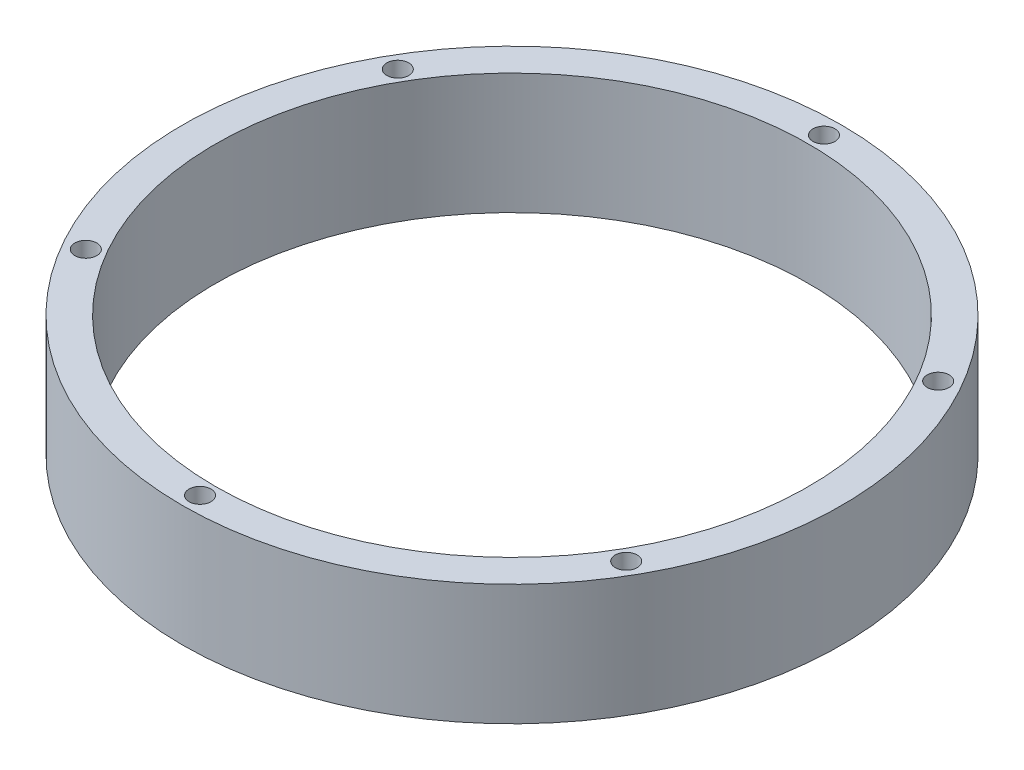
ISO-10303-21;
HEADER;
FILE_DESCRIPTION(('STEP AP214'),'2;1');
FILE_NAME('part.step','',(''),(''),'','','');
FILE_SCHEMA(('AUTOMOTIVE_DESIGN { 1 0 10303 214 1 1 1 1 }'));
ENDSEC;
DATA;
#1=APPLICATION_CONTEXT('core data for automotive mechanical design processes');
#2=APPLICATION_PROTOCOL_DEFINITION('international standard','automotive_design',2000,#1);
#3=PRODUCT_CONTEXT('',#1,'mechanical');
#4=PRODUCT('Part','Part','',(#3));
#5=PRODUCT_RELATED_PRODUCT_CATEGORY('part','',(#4));
#6=PRODUCT_DEFINITION_FORMATION('','',#4);
#7=PRODUCT_DEFINITION_CONTEXT('part definition',#1,'design');
#8=PRODUCT_DEFINITION('design','',#6,#7);
#9=PRODUCT_DEFINITION_SHAPE('','',#8);
#10=(LENGTH_UNIT() NAMED_UNIT(*) SI_UNIT(.MILLI.,.METRE.));
#11=(NAMED_UNIT(*) PLANE_ANGLE_UNIT() SI_UNIT($,.RADIAN.));
#12=(NAMED_UNIT(*) SI_UNIT($,.STERADIAN.) SOLID_ANGLE_UNIT());
#13=UNCERTAINTY_MEASURE_WITH_UNIT(LENGTH_MEASURE(1.E-05),#10,'distance_accuracy_value','');
#14=(GEOMETRIC_REPRESENTATION_CONTEXT(3) GLOBAL_UNCERTAINTY_ASSIGNED_CONTEXT((#13)) GLOBAL_UNIT_ASSIGNED_CONTEXT((#10,
#11,#12)) REPRESENTATION_CONTEXT('',''));
#15=CARTESIAN_POINT('',(0.,0.,0.));
#16=DIRECTION('',(0.,0.,1.));
#17=DIRECTION('',(1.,0.,0.));
#18=AXIS2_PLACEMENT_3D('',#15,#16,#17);
#19=CARTESIAN_POINT('',(0.,16.5,0.));
#20=DIRECTION('',(0.,1.,0.));
#21=DIRECTION('',(0.,0.,1.));
#22=AXIS2_PLACEMENT_3D('',#19,#20,#21);
#23=PLANE('',#22);
#24=CARTESIAN_POINT('',(-61.4878036686947,16.5,-35.5000000000007));
#25=DIRECTION('',(0.,1.,0.));
#26=DIRECTION('',(0.866025403784433,0.,0.50000000000001));
#27=AXIS2_PLACEMENT_3D('',#24,#25,#26);
#28=CIRCLE('',#27,2.5);
#29=CARTESIAN_POINT('',(-59.3227401592336,16.5,-34.2500000000007));
#30=VERTEX_POINT('',#29);
#31=EDGE_CURVE('E75',#30,#30,#28,.T.);
#32=ORIENTED_EDGE('',*,*,#31,.F.);
#33=EDGE_LOOP('',(#32));
#34=FACE_BOUND('',#33,.T.);
#35=CARTESIAN_POINT('',(-61.4878036686955,16.5,35.4999999999994));
#36=DIRECTION('',(0.,1.,0.));
#37=DIRECTION('',(0.866025403784443,0.,-0.499999999999992));
#38=AXIS2_PLACEMENT_3D('',#35,#36,#37);
#39=CIRCLE('',#38,2.5);
#40=CARTESIAN_POINT('',(-59.3227401592344,16.5,34.2499999999994));
#41=VERTEX_POINT('',#40);
#42=EDGE_CURVE('E83',#41,#41,#39,.T.);
#43=ORIENTED_EDGE('',*,*,#42,.F.);
#44=EDGE_LOOP('',(#43));
#45=FACE_BOUND('',#44,.T.);
#46=CARTESIAN_POINT('',(0.,16.5,71.));
#47=DIRECTION('',(0.,1.,0.));
#48=DIRECTION('',(0.,0.,-1.));
#49=AXIS2_PLACEMENT_3D('',#46,#47,#48);
#50=CIRCLE('',#49,2.5);
#51=CARTESIAN_POINT('',(0.,16.5,68.5));
#52=VERTEX_POINT('',#51);
#53=EDGE_CURVE('E91',#52,#52,#50,.T.);
#54=ORIENTED_EDGE('',*,*,#53,.F.);
#55=EDGE_LOOP('',(#54));
#56=FACE_BOUND('',#55,.T.);
#57=CARTESIAN_POINT('',(61.487803668695,16.5,35.5000000000003));
#58=DIRECTION('',(0.,1.,0.));
#59=DIRECTION('',(-0.866025403784436,0.,-0.500000000000004));
#60=AXIS2_PLACEMENT_3D('',#57,#58,#59);
#61=CIRCLE('',#60,2.5);
#62=CARTESIAN_POINT('',(59.3227401592339,16.5,34.2500000000003));
#63=VERTEX_POINT('',#62);
#64=EDGE_CURVE('E99',#63,#63,#61,.T.);
#65=ORIENTED_EDGE('',*,*,#64,.F.);
#66=EDGE_LOOP('',(#65));
#67=FACE_BOUND('',#66,.T.);
#68=CARTESIAN_POINT('',(61.4878036686952,16.5,-35.4999999999999));
#69=DIRECTION('',(0.,1.,0.));
#70=DIRECTION('',(-0.86602540378444,0.,0.499999999999998));
#71=AXIS2_PLACEMENT_3D('',#68,#69,#70);
#72=CIRCLE('',#71,2.5);
#73=CARTESIAN_POINT('',(59.3227401592341,16.5,-34.2499999999999));
#74=VERTEX_POINT('',#73);
#75=EDGE_CURVE('E67',#74,#74,#72,.T.);
#76=ORIENTED_EDGE('',*,*,#75,.F.);
#77=EDGE_LOOP('',(#76));
#78=FACE_BOUND('',#77,.T.);
#79=CARTESIAN_POINT('',(0.,16.5,-71.));
#80=DIRECTION('',(0.,1.,0.));
#81=DIRECTION('',(0.,0.,1.));
#82=AXIS2_PLACEMENT_3D('',#79,#80,#81);
#83=CIRCLE('',#82,2.5);
#84=CARTESIAN_POINT('',(0.,16.5,-68.5));
#85=VERTEX_POINT('',#84);
#86=EDGE_CURVE('E59',#85,#85,#83,.T.);
#87=ORIENTED_EDGE('',*,*,#86,.F.);
#88=EDGE_LOOP('',(#87));
#89=FACE_BOUND('',#88,.T.);
#90=CARTESIAN_POINT('',(0.,16.5,0.));
#91=DIRECTION('',(0.,1.,0.));
#92=DIRECTION('',(0.,0.,1.));
#93=AXIS2_PLACEMENT_3D('',#90,#91,#92);
#94=CIRCLE('',#93,75.);
#95=CARTESIAN_POINT('',(0.,16.5,75.));
#96=VERTEX_POINT('',#95);
#97=EDGE_CURVE('E10',#96,#96,#94,.T.);
#98=ORIENTED_EDGE('',*,*,#97,.T.);
#99=EDGE_LOOP('',(#98));
#100=FACE_BOUND('',#99,.T.);
#101=CARTESIAN_POINT('',(0.,16.5,0.));
#102=DIRECTION('',(0.,1.,0.));
#103=DIRECTION('',(0.,0.,1.));
#104=AXIS2_PLACEMENT_3D('',#101,#102,#103);
#105=CIRCLE('',#104,67.5);
#106=CARTESIAN_POINT('',(0.,16.5,67.5));
#107=VERTEX_POINT('',#106);
#108=EDGE_CURVE('E49',#107,#107,#105,.T.);
#109=ORIENTED_EDGE('',*,*,#108,.F.);
#110=EDGE_LOOP('',(#109));
#111=FACE_BOUND('',#110,.T.);
#112=ADVANCED_FACE('F36',(#34,#45,#56,#67,#78,#89,#100,#111),#23,.T.);
#113=CARTESIAN_POINT('',(0.,-11.,0.));
#114=DIRECTION('',(0.,1.,0.));
#115=DIRECTION('',(0.,0.,1.));
#116=AXIS2_PLACEMENT_3D('',#113,#114,#115);
#117=PLANE('',#116);
#118=CARTESIAN_POINT('',(-61.4878036686947,-11.,-35.5000000000007));
#119=DIRECTION('',(0.,1.,0.));
#120=DIRECTION('',(0.866025403784433,0.,0.50000000000001));
#121=AXIS2_PLACEMENT_3D('',#118,#119,#120);
#122=CIRCLE('',#121,2.5);
#123=CARTESIAN_POINT('',(-59.3227401592336,-11.,-34.2500000000007));
#124=VERTEX_POINT('',#123);
#125=EDGE_CURVE('E79',#124,#124,#122,.T.);
#126=ORIENTED_EDGE('',*,*,#125,.T.);
#127=EDGE_LOOP('',(#126));
#128=FACE_BOUND('',#127,.T.);
#129=CARTESIAN_POINT('',(-61.4878036686955,-11.,35.4999999999994));
#130=DIRECTION('',(0.,1.,0.));
#131=DIRECTION('',(0.866025403784443,0.,-0.499999999999992));
#132=AXIS2_PLACEMENT_3D('',#129,#130,#131);
#133=CIRCLE('',#132,2.5);
#134=CARTESIAN_POINT('',(-59.3227401592344,-11.,34.2499999999994));
#135=VERTEX_POINT('',#134);
#136=EDGE_CURVE('E87',#135,#135,#133,.T.);
#137=ORIENTED_EDGE('',*,*,#136,.T.);
#138=EDGE_LOOP('',(#137));
#139=FACE_BOUND('',#138,.T.);
#140=CARTESIAN_POINT('',(0.,-11.,71.));
#141=DIRECTION('',(0.,1.,0.));
#142=DIRECTION('',(0.,0.,-1.));
#143=AXIS2_PLACEMENT_3D('',#140,#141,#142);
#144=CIRCLE('',#143,2.5);
#145=CARTESIAN_POINT('',(0.,-11.,68.5));
#146=VERTEX_POINT('',#145);
#147=EDGE_CURVE('E95',#146,#146,#144,.T.);
#148=ORIENTED_EDGE('',*,*,#147,.T.);
#149=EDGE_LOOP('',(#148));
#150=FACE_BOUND('',#149,.T.);
#151=CARTESIAN_POINT('',(61.487803668695,-11.,35.5000000000003));
#152=DIRECTION('',(0.,1.,0.));
#153=DIRECTION('',(-0.866025403784436,0.,-0.500000000000004));
#154=AXIS2_PLACEMENT_3D('',#151,#152,#153);
#155=CIRCLE('',#154,2.5);
#156=CARTESIAN_POINT('',(59.3227401592339,-11.,34.2500000000003));
#157=VERTEX_POINT('',#156);
#158=EDGE_CURVE('E71',#157,#157,#155,.T.);
#159=ORIENTED_EDGE('',*,*,#158,.T.);
#160=EDGE_LOOP('',(#159));
#161=FACE_BOUND('',#160,.T.);
#162=CARTESIAN_POINT('',(61.4878036686952,-11.,-35.4999999999999));
#163=DIRECTION('',(0.,1.,0.));
#164=DIRECTION('',(-0.86602540378444,0.,0.499999999999998));
#165=AXIS2_PLACEMENT_3D('',#162,#163,#164);
#166=CIRCLE('',#165,2.5);
#167=CARTESIAN_POINT('',(59.3227401592341,-11.,-34.2499999999999));
#168=VERTEX_POINT('',#167);
#169=EDGE_CURVE('E63',#168,#168,#166,.T.);
#170=ORIENTED_EDGE('',*,*,#169,.T.);
#171=EDGE_LOOP('',(#170));
#172=FACE_BOUND('',#171,.T.);
#173=CARTESIAN_POINT('',(0.,-11.,-71.));
#174=DIRECTION('',(0.,1.,0.));
#175=DIRECTION('',(0.,0.,1.));
#176=AXIS2_PLACEMENT_3D('',#173,#174,#175);
#177=CIRCLE('',#176,2.5);
#178=CARTESIAN_POINT('',(0.,-11.,-68.5));
#179=VERTEX_POINT('',#178);
#180=EDGE_CURVE('E55',#179,#179,#177,.T.);
#181=ORIENTED_EDGE('',*,*,#180,.T.);
#182=EDGE_LOOP('',(#181));
#183=FACE_BOUND('',#182,.T.);
#184=CARTESIAN_POINT('',(0.,-11.,0.));
#185=DIRECTION('',(0.,1.,0.));
#186=DIRECTION('',(0.,0.,1.));
#187=AXIS2_PLACEMENT_3D('',#184,#185,#186);
#188=CIRCLE('',#187,75.);
#189=CARTESIAN_POINT('',(0.,-11.,75.));
#190=VERTEX_POINT('',#189);
#191=EDGE_CURVE('E40',#190,#190,#188,.T.);
#192=ORIENTED_EDGE('',*,*,#191,.F.);
#193=EDGE_LOOP('',(#192));
#194=FACE_BOUND('',#193,.T.);
#195=CARTESIAN_POINT('',(0.,-11.,0.));
#196=DIRECTION('',(0.,1.,0.));
#197=DIRECTION('',(0.,0.,1.));
#198=AXIS2_PLACEMENT_3D('',#195,#196,#197);
#199=CIRCLE('',#198,67.5);
#200=CARTESIAN_POINT('',(0.,-11.,67.5));
#201=VERTEX_POINT('',#200);
#202=EDGE_CURVE('E51',#201,#201,#199,.T.);
#203=ORIENTED_EDGE('',*,*,#202,.T.);
#204=EDGE_LOOP('',(#203));
#205=FACE_BOUND('',#204,.T.);
#206=ADVANCED_FACE('F107',(#128,#139,#150,#161,#172,#183,#194,#205),#117,.F.);
#207=CARTESIAN_POINT('',(0.,16.5,0.));
#208=DIRECTION('',(0.,-1.,0.));
#209=DIRECTION('',(0.,0.,-1.));
#210=AXIS2_PLACEMENT_3D('',#207,#208,#209);
#211=CYLINDRICAL_SURFACE('',#210,75.);
#212=ORIENTED_EDGE('',*,*,#97,.F.);
#213=EDGE_LOOP('',(#212));
#214=FACE_BOUND('',#213,.T.);
#215=ORIENTED_EDGE('',*,*,#191,.T.);
#216=EDGE_LOOP('',(#215));
#217=FACE_BOUND('',#216,.T.);
#218=ADVANCED_FACE('F38',(#214,#217),#211,.T.);
#219=CARTESIAN_POINT('',(0.,16.5,0.));
#220=DIRECTION('',(0.,-1.,0.));
#221=DIRECTION('',(0.,0.,-1.));
#222=AXIS2_PLACEMENT_3D('',#219,#220,#221);
#223=CYLINDRICAL_SURFACE('',#222,67.5);
#224=ORIENTED_EDGE('',*,*,#108,.T.);
#225=EDGE_LOOP('',(#224));
#226=FACE_BOUND('',#225,.T.);
#227=ORIENTED_EDGE('',*,*,#202,.F.);
#228=EDGE_LOOP('',(#227));
#229=FACE_BOUND('',#228,.T.);
#230=ADVANCED_FACE('F128',(#226,#229),#223,.F.);
#231=CARTESIAN_POINT('',(0.,-11.,-71.));
#232=DIRECTION('',(0.,1.,0.));
#233=DIRECTION('',(0.,0.,1.));
#234=AXIS2_PLACEMENT_3D('',#231,#232,#233);
#235=CYLINDRICAL_SURFACE('',#234,2.5);
#236=ORIENTED_EDGE('',*,*,#180,.F.);
#237=EDGE_LOOP('',(#236));
#238=FACE_BOUND('',#237,.T.);
#239=ORIENTED_EDGE('',*,*,#86,.T.);
#240=EDGE_LOOP('',(#239));
#241=FACE_BOUND('',#240,.T.);
#242=ADVANCED_FACE('F131',(#238,#241),#235,.F.);
#243=CARTESIAN_POINT('',(61.4878036686952,-11.,-35.4999999999999));
#244=DIRECTION('',(0.,1.,0.));
#245=DIRECTION('',(0.,0.,1.));
#246=AXIS2_PLACEMENT_3D('',#243,#244,#245);
#247=CYLINDRICAL_SURFACE('',#246,2.5);
#248=ORIENTED_EDGE('',*,*,#169,.F.);
#249=EDGE_LOOP('',(#248));
#250=FACE_BOUND('',#249,.T.);
#251=ORIENTED_EDGE('',*,*,#75,.T.);
#252=EDGE_LOOP('',(#251));
#253=FACE_BOUND('',#252,.T.);
#254=ADVANCED_FACE('F114',(#250,#253),#247,.F.);
#255=CARTESIAN_POINT('',(61.487803668695,-11.,35.5000000000003));
#256=DIRECTION('',(0.,1.,0.));
#257=DIRECTION('',(0.,0.,1.));
#258=AXIS2_PLACEMENT_3D('',#255,#256,#257);
#259=CYLINDRICAL_SURFACE('',#258,2.5);
#260=ORIENTED_EDGE('',*,*,#158,.F.);
#261=EDGE_LOOP('',(#260));
#262=FACE_BOUND('',#261,.T.);
#263=ORIENTED_EDGE('',*,*,#64,.T.);
#264=EDGE_LOOP('',(#263));
#265=FACE_BOUND('',#264,.T.);
#266=ADVANCED_FACE('F110',(#262,#265),#259,.F.);
#267=CARTESIAN_POINT('',(0.,-11.,71.));
#268=DIRECTION('',(0.,1.,0.));
#269=DIRECTION('',(0.,0.,1.));
#270=AXIS2_PLACEMENT_3D('',#267,#268,#269);
#271=CYLINDRICAL_SURFACE('',#270,2.5);
#272=ORIENTED_EDGE('',*,*,#147,.F.);
#273=EDGE_LOOP('',(#272));
#274=FACE_BOUND('',#273,.T.);
#275=ORIENTED_EDGE('',*,*,#53,.T.);
#276=EDGE_LOOP('',(#275));
#277=FACE_BOUND('',#276,.T.);
#278=ADVANCED_FACE('F113',(#274,#277),#271,.F.);
#279=CARTESIAN_POINT('',(-61.4878036686955,-11.,35.4999999999994));
#280=DIRECTION('',(0.,1.,0.));
#281=DIRECTION('',(0.,0.,1.));
#282=AXIS2_PLACEMENT_3D('',#279,#280,#281);
#283=CYLINDRICAL_SURFACE('',#282,2.5);
#284=ORIENTED_EDGE('',*,*,#136,.F.);
#285=EDGE_LOOP('',(#284));
#286=FACE_BOUND('',#285,.T.);
#287=ORIENTED_EDGE('',*,*,#42,.T.);
#288=EDGE_LOOP('',(#287));
#289=FACE_BOUND('',#288,.T.);
#290=ADVANCED_FACE('F152',(#286,#289),#283,.F.);
#291=CARTESIAN_POINT('',(-61.4878036686947,-11.,-35.5000000000007));
#292=DIRECTION('',(0.,1.,0.));
#293=DIRECTION('',(0.,0.,1.));
#294=AXIS2_PLACEMENT_3D('',#291,#292,#293);
#295=CYLINDRICAL_SURFACE('',#294,2.5);
#296=ORIENTED_EDGE('',*,*,#125,.F.);
#297=EDGE_LOOP('',(#296));
#298=FACE_BOUND('',#297,.T.);
#299=ORIENTED_EDGE('',*,*,#31,.T.);
#300=EDGE_LOOP('',(#299));
#301=FACE_BOUND('',#300,.T.);
#302=ADVANCED_FACE('F149',(#298,#301),#295,.F.);
#303=CLOSED_SHELL('',(#112,#206,#218,#230,#242,#254,#266,#278,#290,#302));
#304=MANIFOLD_SOLID_BREP('B2',#303);
#305=ADVANCED_BREP_SHAPE_REPRESENTATION('',(#18,#304),#14);
#306=SHAPE_DEFINITION_REPRESENTATION(#9,#305);
ENDSEC;
END-ISO-10303-21;
